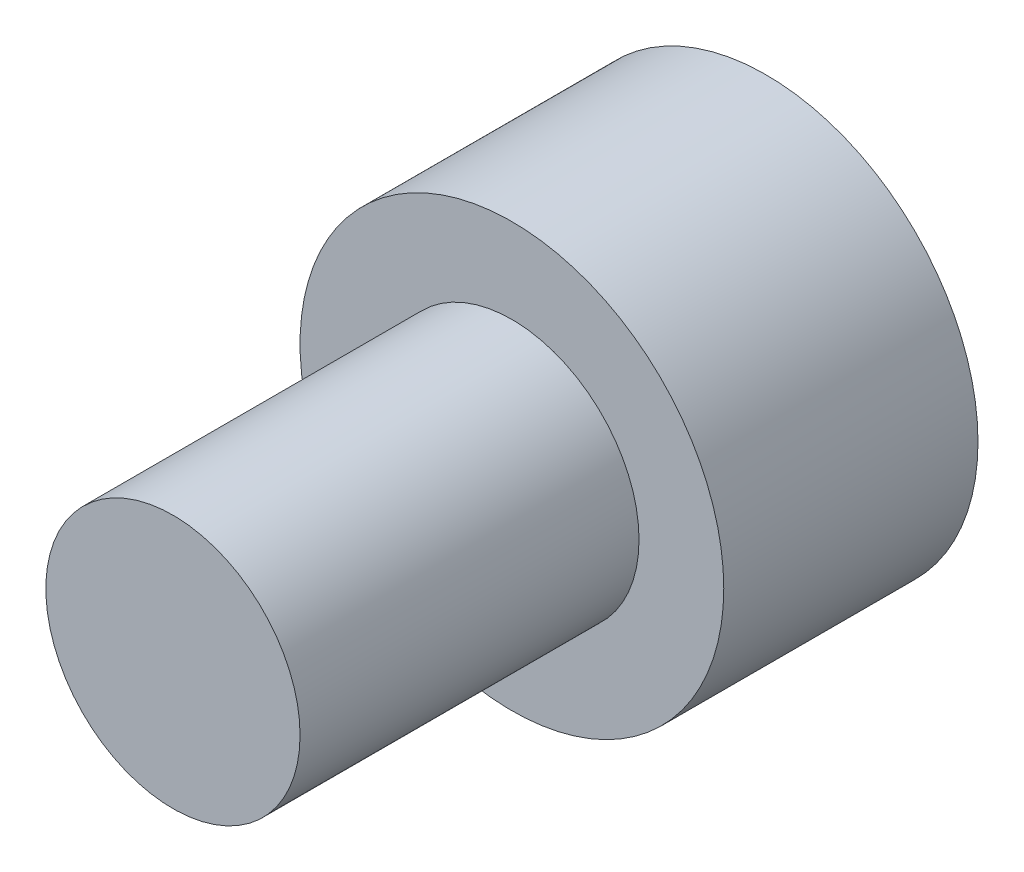
ISO-10303-21;
HEADER;
FILE_DESCRIPTION(('STEP AP214'),'2;1');
FILE_NAME('part.step','',(''),(''),'','','');
FILE_SCHEMA(('AUTOMOTIVE_DESIGN { 1 0 10303 214 1 1 1 1 }'));
ENDSEC;
DATA;
#1=APPLICATION_CONTEXT('core data for automotive mechanical design processes');
#2=APPLICATION_PROTOCOL_DEFINITION('international standard','automotive_design',2000,#1);
#3=PRODUCT_CONTEXT('',#1,'mechanical');
#4=PRODUCT('Part','Part','',(#3));
#5=PRODUCT_RELATED_PRODUCT_CATEGORY('part','',(#4));
#6=PRODUCT_DEFINITION_FORMATION('','',#4);
#7=PRODUCT_DEFINITION_CONTEXT('part definition',#1,'design');
#8=PRODUCT_DEFINITION('design','',#6,#7);
#9=PRODUCT_DEFINITION_SHAPE('','',#8);
#10=(LENGTH_UNIT() NAMED_UNIT(*) SI_UNIT(.MILLI.,.METRE.));
#11=(NAMED_UNIT(*) PLANE_ANGLE_UNIT() SI_UNIT($,.RADIAN.));
#12=(NAMED_UNIT(*) SI_UNIT($,.STERADIAN.) SOLID_ANGLE_UNIT());
#13=UNCERTAINTY_MEASURE_WITH_UNIT(LENGTH_MEASURE(1.E-05),#10,'distance_accuracy_value','');
#14=(GEOMETRIC_REPRESENTATION_CONTEXT(3) GLOBAL_UNCERTAINTY_ASSIGNED_CONTEXT((#13)) GLOBAL_UNIT_ASSIGNED_CONTEXT((#10,
#11,#12)) REPRESENTATION_CONTEXT('',''));
#15=CARTESIAN_POINT('',(0.,0.,0.));
#16=DIRECTION('',(0.,0.,1.));
#17=DIRECTION('',(1.,0.,0.));
#18=AXIS2_PLACEMENT_3D('',#15,#16,#17);
#19=CARTESIAN_POINT('',(0.,0.,0.));
#20=DIRECTION('',(0.,0.,1.));
#21=DIRECTION('',(1.,0.,0.));
#22=AXIS2_PLACEMENT_3D('',#19,#20,#21);
#23=PLANE('',#22);
#24=CARTESIAN_POINT('',(0.,0.,0.));
#25=DIRECTION('',(0.,0.,1.));
#26=DIRECTION('',(1.,0.,0.));
#27=AXIS2_PLACEMENT_3D('',#24,#25,#26);
#28=CIRCLE('',#27,5.);
#29=CARTESIAN_POINT('',(5.,0.,0.));
#30=VERTEX_POINT('',#29);
#31=EDGE_CURVE('E42',#30,#30,#28,.T.);
#32=ORIENTED_EDGE('',*,*,#31,.F.);
#33=EDGE_LOOP('',(#32));
#34=FACE_BOUND('',#33,.T.);
#35=DIRECTION('',(-1.,0.,0.));
#36=VECTOR('',#35,1.);
#37=CARTESIAN_POINT('',(0.,2.5,0.));
#38=LINE('',#37,#36);
#39=CARTESIAN_POINT('',(1.44337567297406,2.5,0.));
#40=VERTEX_POINT('',#39);
#41=CARTESIAN_POINT('',(-1.44337567297406,2.5,0.));
#42=VERTEX_POINT('',#41);
#43=EDGE_CURVE('E55',#40,#42,#38,.T.);
#44=ORIENTED_EDGE('',*,*,#43,.T.);
#45=DIRECTION('',(-0.5,-0.866025403784439,0.));
#46=VECTOR('',#45,1.);
#47=CARTESIAN_POINT('',(-2.1650635094611,1.25,0.));
#48=LINE('',#47,#46);
#49=CARTESIAN_POINT('',(-2.88675134594813,0.,0.));
#50=VERTEX_POINT('',#49);
#51=EDGE_CURVE('E126',#42,#50,#48,.T.);
#52=ORIENTED_EDGE('',*,*,#51,.T.);
#53=DIRECTION('',(0.5,-0.866025403784439,0.));
#54=VECTOR('',#53,1.);
#55=CARTESIAN_POINT('',(-2.1650635094611,-1.25,0.));
#56=LINE('',#55,#54);
#57=CARTESIAN_POINT('',(-1.44337567297406,-2.5,0.));
#58=VERTEX_POINT('',#57);
#59=EDGE_CURVE('E129',#50,#58,#56,.T.);
#60=ORIENTED_EDGE('',*,*,#59,.T.);
#61=DIRECTION('',(1.,0.,0.));
#62=VECTOR('',#61,1.);
#63=CARTESIAN_POINT('',(0.,-2.5,0.));
#64=LINE('',#63,#62);
#65=CARTESIAN_POINT('',(1.44337567297406,-2.5,0.));
#66=VERTEX_POINT('',#65);
#67=EDGE_CURVE('E132',#58,#66,#64,.T.);
#68=ORIENTED_EDGE('',*,*,#67,.T.);
#69=DIRECTION('',(0.5,0.866025403784439,0.));
#70=VECTOR('',#69,1.);
#71=CARTESIAN_POINT('',(2.1650635094611,-1.25,0.));
#72=LINE('',#71,#70);
#73=CARTESIAN_POINT('',(2.88675134594813,0.,0.));
#74=VERTEX_POINT('',#73);
#75=EDGE_CURVE('E116',#66,#74,#72,.T.);
#76=ORIENTED_EDGE('',*,*,#75,.T.);
#77=DIRECTION('',(-0.5,0.866025403784438,0.));
#78=VECTOR('',#77,1.);
#79=CARTESIAN_POINT('',(2.1650635094611,1.25,0.));
#80=LINE('',#79,#78);
#81=EDGE_CURVE('E135',#74,#40,#80,.T.);
#82=ORIENTED_EDGE('',*,*,#81,.T.);
#83=EDGE_LOOP('',(#44,#52,#60,#68,#76,#82));
#84=FACE_BOUND('',#83,.T.);
#85=ADVANCED_FACE('F38',(#34,#84),#23,.F.);
#86=CARTESIAN_POINT('',(0.,0.,6.));
#87=DIRECTION('',(0.,0.,-1.));
#88=DIRECTION('',(-1.,0.,0.));
#89=AXIS2_PLACEMENT_3D('',#86,#87,#88);
#90=CYLINDRICAL_SURFACE('',#89,5.);
#91=CARTESIAN_POINT('',(0.,0.,6.));
#92=DIRECTION('',(0.,0.,1.));
#93=DIRECTION('',(1.,0.,0.));
#94=AXIS2_PLACEMENT_3D('',#91,#92,#93);
#95=CIRCLE('',#94,5.);
#96=CARTESIAN_POINT('',(5.,0.,6.));
#97=VERTEX_POINT('',#96);
#98=EDGE_CURVE('E47',#97,#97,#95,.T.);
#99=ORIENTED_EDGE('',*,*,#98,.F.);
#100=EDGE_LOOP('',(#99));
#101=FACE_BOUND('',#100,.T.);
#102=ORIENTED_EDGE('',*,*,#31,.T.);
#103=EDGE_LOOP('',(#102));
#104=FACE_BOUND('',#103,.T.);
#105=ADVANCED_FACE('F40',(#101,#104),#90,.T.);
#106=CARTESIAN_POINT('',(0.,0.,6.));
#107=DIRECTION('',(0.,0.,1.));
#108=DIRECTION('',(1.,0.,0.));
#109=AXIS2_PLACEMENT_3D('',#106,#107,#108);
#110=PLANE('',#109);
#111=CARTESIAN_POINT('',(0.,0.,6.));
#112=DIRECTION('',(0.,0.,1.));
#113=DIRECTION('',(1.,0.,0.));
#114=AXIS2_PLACEMENT_3D('',#111,#112,#113);
#115=CIRCLE('',#114,3.);
#116=CARTESIAN_POINT('',(3.,0.,6.));
#117=VERTEX_POINT('',#116);
#118=EDGE_CURVE('E11',#117,#117,#115,.T.);
#119=ORIENTED_EDGE('',*,*,#118,.F.);
#120=EDGE_LOOP('',(#119));
#121=FACE_BOUND('',#120,.T.);
#122=ORIENTED_EDGE('',*,*,#98,.T.);
#123=EDGE_LOOP('',(#122));
#124=FACE_BOUND('',#123,.T.);
#125=ADVANCED_FACE('F185',(#121,#124),#110,.T.);
#126=CARTESIAN_POINT('',(0.,0.,14.));
#127=DIRECTION('',(0.,0.,-1.));
#128=DIRECTION('',(-1.,0.,0.));
#129=AXIS2_PLACEMENT_3D('',#126,#127,#128);
#130=CYLINDRICAL_SURFACE('',#129,3.);
#131=CARTESIAN_POINT('',(0.,0.,14.));
#132=DIRECTION('',(0.,0.,1.));
#133=DIRECTION('',(1.,0.,0.));
#134=AXIS2_PLACEMENT_3D('',#131,#132,#133);
#135=CIRCLE('',#134,3.);
#136=CARTESIAN_POINT('',(3.,0.,14.));
#137=VERTEX_POINT('',#136);
#138=EDGE_CURVE('E146',#137,#137,#135,.T.);
#139=ORIENTED_EDGE('',*,*,#138,.F.);
#140=EDGE_LOOP('',(#139));
#141=FACE_BOUND('',#140,.T.);
#142=ORIENTED_EDGE('',*,*,#118,.T.);
#143=EDGE_LOOP('',(#142));
#144=FACE_BOUND('',#143,.T.);
#145=ADVANCED_FACE('F181',(#141,#144),#130,.T.);
#146=CARTESIAN_POINT('',(0.,0.,14.));
#147=DIRECTION('',(0.,0.,1.));
#148=DIRECTION('',(1.,0.,0.));
#149=AXIS2_PLACEMENT_3D('',#146,#147,#148);
#150=PLANE('',#149);
#151=ORIENTED_EDGE('',*,*,#138,.T.);
#152=EDGE_LOOP('',(#151));
#153=FACE_BOUND('',#152,.T.);
#154=ADVANCED_FACE('F175',(#153),#150,.T.);
#155=CARTESIAN_POINT('',(0.,2.5,4.));
#156=DIRECTION('',(0.,-1.,0.));
#157=DIRECTION('',(0.,0.,-1.));
#158=AXIS2_PLACEMENT_3D('',#155,#156,#157);
#159=PLANE('',#158);
#160=ORIENTED_EDGE('',*,*,#43,.F.);
#161=DIRECTION('',(0.,0.,-1.));
#162=VECTOR('',#161,1.);
#163=CARTESIAN_POINT('',(1.44337567297406,2.5,4.));
#164=LINE('',#163,#162);
#165=CARTESIAN_POINT('',(1.44337567297406,2.5,4.));
#166=VERTEX_POINT('',#165);
#167=EDGE_CURVE('E121',#166,#40,#164,.T.);
#168=ORIENTED_EDGE('',*,*,#167,.F.);
#169=DIRECTION('',(-1.,0.,0.));
#170=VECTOR('',#169,1.);
#171=CARTESIAN_POINT('',(0.,2.5,4.));
#172=LINE('',#171,#170);
#173=CARTESIAN_POINT('',(-1.44337567297406,2.5,4.));
#174=VERTEX_POINT('',#173);
#175=EDGE_CURVE('E138',#166,#174,#172,.T.);
#176=ORIENTED_EDGE('',*,*,#175,.T.);
#177=DIRECTION('',(0.,0.,-1.));
#178=VECTOR('',#177,1.);
#179=CARTESIAN_POINT('',(-1.44337567297406,2.5,4.));
#180=LINE('',#179,#178);
#181=EDGE_CURVE('E144',#174,#42,#180,.T.);
#182=ORIENTED_EDGE('',*,*,#181,.T.);
#183=EDGE_LOOP('',(#160,#168,#176,#182));
#184=FACE_BOUND('',#183,.T.);
#185=ADVANCED_FACE('F158',(#184),#159,.T.);
#186=CARTESIAN_POINT('',(-2.1650635094611,1.25,4.));
#187=DIRECTION('',(0.866025403784439,-0.5,0.));
#188=DIRECTION('',(0.5,0.866025403784439,0.));
#189=AXIS2_PLACEMENT_3D('',#186,#187,#188);
#190=PLANE('',#189);
#191=ORIENTED_EDGE('',*,*,#51,.F.);
#192=ORIENTED_EDGE('',*,*,#181,.F.);
#193=DIRECTION('',(-0.5,-0.866025403784439,0.));
#194=VECTOR('',#193,1.);
#195=CARTESIAN_POINT('',(-2.1650635094611,1.25,4.));
#196=LINE('',#195,#194);
#197=CARTESIAN_POINT('',(-2.88675134594813,0.,4.));
#198=VERTEX_POINT('',#197);
#199=EDGE_CURVE('E94',#174,#198,#196,.T.);
#200=ORIENTED_EDGE('',*,*,#199,.T.);
#201=DIRECTION('',(0.,0.,-1.));
#202=VECTOR('',#201,1.);
#203=CARTESIAN_POINT('',(-2.88675134594813,0.,4.));
#204=LINE('',#203,#202);
#205=EDGE_CURVE('E142',#198,#50,#204,.T.);
#206=ORIENTED_EDGE('',*,*,#205,.T.);
#207=EDGE_LOOP('',(#191,#192,#200,#206));
#208=FACE_BOUND('',#207,.T.);
#209=ADVANCED_FACE('F167',(#208),#190,.T.);
#210=CARTESIAN_POINT('',(-2.1650635094611,-1.25,4.));
#211=DIRECTION('',(0.866025403784439,0.5,0.));
#212=DIRECTION('',(-0.5,0.866025403784439,0.));
#213=AXIS2_PLACEMENT_3D('',#210,#211,#212);
#214=PLANE('',#213);
#215=ORIENTED_EDGE('',*,*,#59,.F.);
#216=ORIENTED_EDGE('',*,*,#205,.F.);
#217=DIRECTION('',(0.5,-0.866025403784439,0.));
#218=VECTOR('',#217,1.);
#219=CARTESIAN_POINT('',(-2.1650635094611,-1.25,4.));
#220=LINE('',#219,#218);
#221=CARTESIAN_POINT('',(-1.44337567297406,-2.5,4.));
#222=VERTEX_POINT('',#221);
#223=EDGE_CURVE('E112',#198,#222,#220,.T.);
#224=ORIENTED_EDGE('',*,*,#223,.T.);
#225=DIRECTION('',(0.,0.,-1.));
#226=VECTOR('',#225,1.);
#227=CARTESIAN_POINT('',(-1.44337567297406,-2.5,4.));
#228=LINE('',#227,#226);
#229=EDGE_CURVE('E109',#222,#58,#228,.T.);
#230=ORIENTED_EDGE('',*,*,#229,.T.);
#231=EDGE_LOOP('',(#215,#216,#224,#230));
#232=FACE_BOUND('',#231,.T.);
#233=ADVANCED_FACE('F165',(#232),#214,.T.);
#234=CARTESIAN_POINT('',(0.,-2.5,4.));
#235=DIRECTION('',(0.,1.,0.));
#236=DIRECTION('',(-1.,0.,0.));
#237=AXIS2_PLACEMENT_3D('',#234,#235,#236);
#238=PLANE('',#237);
#239=ORIENTED_EDGE('',*,*,#67,.F.);
#240=ORIENTED_EDGE('',*,*,#229,.F.);
#241=DIRECTION('',(1.,0.,0.));
#242=VECTOR('',#241,1.);
#243=CARTESIAN_POINT('',(0.,-2.5,4.));
#244=LINE('',#243,#242);
#245=CARTESIAN_POINT('',(1.44337567297406,-2.5,4.));
#246=VERTEX_POINT('',#245);
#247=EDGE_CURVE('E104',#222,#246,#244,.T.);
#248=ORIENTED_EDGE('',*,*,#247,.T.);
#249=DIRECTION('',(0.,0.,-1.));
#250=VECTOR('',#249,1.);
#251=CARTESIAN_POINT('',(1.44337567297406,-2.5,4.));
#252=LINE('',#251,#250);
#253=EDGE_CURVE('E108',#246,#66,#252,.T.);
#254=ORIENTED_EDGE('',*,*,#253,.T.);
#255=EDGE_LOOP('',(#239,#240,#248,#254));
#256=FACE_BOUND('',#255,.T.);
#257=ADVANCED_FACE('F107',(#256),#238,.T.);
#258=CARTESIAN_POINT('',(2.1650635094611,-1.25,4.));
#259=DIRECTION('',(-0.866025403784439,0.5,0.));
#260=DIRECTION('',(-0.5,-0.866025403784439,0.));
#261=AXIS2_PLACEMENT_3D('',#258,#259,#260);
#262=PLANE('',#261);
#263=ORIENTED_EDGE('',*,*,#75,.F.);
#264=ORIENTED_EDGE('',*,*,#253,.F.);
#265=DIRECTION('',(0.5,0.866025403784439,0.));
#266=VECTOR('',#265,1.);
#267=CARTESIAN_POINT('',(2.1650635094611,-1.25,4.));
#268=LINE('',#267,#266);
#269=CARTESIAN_POINT('',(2.88675134594813,0.,4.));
#270=VERTEX_POINT('',#269);
#271=EDGE_CURVE('E111',#246,#270,#268,.T.);
#272=ORIENTED_EDGE('',*,*,#271,.T.);
#273=DIRECTION('',(0.,0.,-1.));
#274=VECTOR('',#273,1.);
#275=CARTESIAN_POINT('',(2.88675134594813,0.,4.));
#276=LINE('',#275,#274);
#277=EDGE_CURVE('E85',#270,#74,#276,.T.);
#278=ORIENTED_EDGE('',*,*,#277,.T.);
#279=EDGE_LOOP('',(#263,#264,#272,#278));
#280=FACE_BOUND('',#279,.T.);
#281=ADVANCED_FACE('F114',(#280),#262,.T.);
#282=CARTESIAN_POINT('',(2.1650635094611,1.25,4.));
#283=DIRECTION('',(-0.866025403784438,-0.5,0.));
#284=DIRECTION('',(0.5,-0.866025403784438,0.));
#285=AXIS2_PLACEMENT_3D('',#282,#283,#284);
#286=PLANE('',#285);
#287=ORIENTED_EDGE('',*,*,#81,.F.);
#288=ORIENTED_EDGE('',*,*,#277,.F.);
#289=DIRECTION('',(-0.5,0.866025403784438,0.));
#290=VECTOR('',#289,1.);
#291=CARTESIAN_POINT('',(2.1650635094611,1.25,4.));
#292=LINE('',#291,#290);
#293=EDGE_CURVE('E63',#270,#166,#292,.T.);
#294=ORIENTED_EDGE('',*,*,#293,.T.);
#295=ORIENTED_EDGE('',*,*,#167,.T.);
#296=EDGE_LOOP('',(#287,#288,#294,#295));
#297=FACE_BOUND('',#296,.T.);
#298=ADVANCED_FACE('F157',(#297),#286,.T.);
#299=CARTESIAN_POINT('',(0.,0.,4.));
#300=DIRECTION('',(0.,0.,1.));
#301=DIRECTION('',(1.,0.,0.));
#302=AXIS2_PLACEMENT_3D('',#299,#300,#301);
#303=PLANE('',#302);
#304=ORIENTED_EDGE('',*,*,#175,.F.);
#305=ORIENTED_EDGE('',*,*,#293,.F.);
#306=ORIENTED_EDGE('',*,*,#271,.F.);
#307=ORIENTED_EDGE('',*,*,#247,.F.);
#308=ORIENTED_EDGE('',*,*,#223,.F.);
#309=ORIENTED_EDGE('',*,*,#199,.F.);
#310=EDGE_LOOP('',(#304,#305,#306,#307,#308,#309));
#311=FACE_BOUND('',#310,.T.);
#312=ADVANCED_FACE('F119',(#311),#303,.F.);
#313=CLOSED_SHELL('',(#85,#105,#125,#145,#154,#185,#209,#233,#257,#281,#298,#312));
#314=MANIFOLD_SOLID_BREP('B2',#313);
#315=ADVANCED_BREP_SHAPE_REPRESENTATION('',(#18,#314),#14);
#316=SHAPE_DEFINITION_REPRESENTATION(#9,#315);
ENDSEC;
END-ISO-10303-21;
